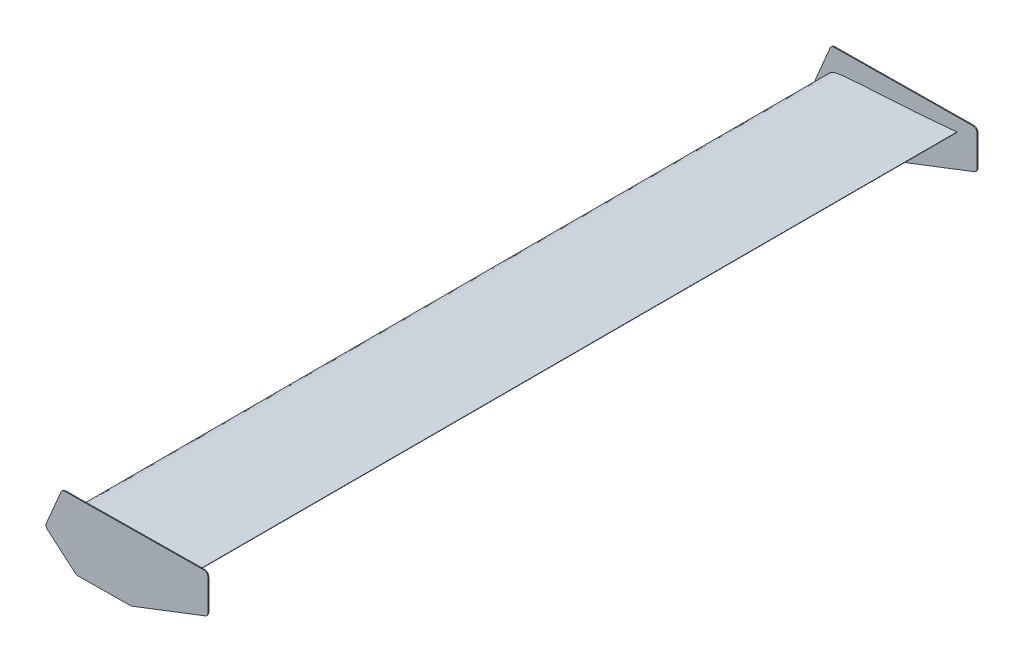
ISO-10303-21;
HEADER;
FILE_DESCRIPTION(('STEP AP214'),'2;1');
FILE_NAME('part.step','',(''),(''),'','','');
FILE_SCHEMA(('AUTOMOTIVE_DESIGN { 1 0 10303 214 1 1 1 1 }'));
ENDSEC;
DATA;
#1=APPLICATION_CONTEXT('core data for automotive mechanical design processes');
#2=APPLICATION_PROTOCOL_DEFINITION('international standard','automotive_design',2000,#1);
#3=PRODUCT_CONTEXT('',#1,'mechanical');
#4=PRODUCT('Part','Part','',(#3));
#5=PRODUCT_RELATED_PRODUCT_CATEGORY('part','',(#4));
#6=PRODUCT_DEFINITION_FORMATION('','',#4);
#7=PRODUCT_DEFINITION_CONTEXT('part definition',#1,'design');
#8=PRODUCT_DEFINITION('design','',#6,#7);
#9=PRODUCT_DEFINITION_SHAPE('','',#8);
#10=(LENGTH_UNIT() NAMED_UNIT(*) SI_UNIT(.MILLI.,.METRE.));
#11=(NAMED_UNIT(*) PLANE_ANGLE_UNIT() SI_UNIT($,.RADIAN.));
#12=(NAMED_UNIT(*) SI_UNIT($,.STERADIAN.) SOLID_ANGLE_UNIT());
#13=UNCERTAINTY_MEASURE_WITH_UNIT(LENGTH_MEASURE(1.E-05),#10,'distance_accuracy_value','');
#14=(GEOMETRIC_REPRESENTATION_CONTEXT(3) GLOBAL_UNCERTAINTY_ASSIGNED_CONTEXT((#13)) GLOBAL_UNIT_ASSIGNED_CONTEXT((#10,
#11,#12)) REPRESENTATION_CONTEXT('',''));
#15=CARTESIAN_POINT('',(0.,0.,0.));
#16=DIRECTION('',(0.,0.,1.));
#17=DIRECTION('',(1.,0.,0.));
#18=AXIS2_PLACEMENT_3D('',#15,#16,#17);
#19=CARTESIAN_POINT('',(0.,0.,899.));
#20=DIRECTION('',(0.,0.,-1.));
#21=DIRECTION('',(-1.,0.,0.));
#22=AXIS2_PLACEMENT_3D('',#19,#20,#21);
#23=PLANE('',#22);
#24=DIRECTION('',(-0.999947428083981,-0.0102538318804609,0.));
#25=VECTOR('',#24,1.);
#26=CARTESIAN_POINT('',(4.19836461655942,59.4066569608688,899.));
#27=LINE('',#26,#25);
#28=CARTESIAN_POINT('',(335.564783335885,62.8046111462092,899.));
#29=VERTEX_POINT('',#28);
#30=CARTESIAN_POINT('',(10.7496298097369,59.4738360644981,899.));
#31=VERTEX_POINT('',#30);
#32=EDGE_CURVE('E240',#29,#31,#27,.T.);
#33=ORIENTED_EDGE('',*,*,#32,.F.);
#34=CARTESIAN_POINT('',(335.667321654689,52.8051368653694,899.));
#35=DIRECTION('',(0.,0.,-1.));
#36=DIRECTION('',(-1.,0.,0.));
#37=AXIS2_PLACEMENT_3D('',#34,#35,#36);
#38=CIRCLE('',#37,10.);
#39=CARTESIAN_POINT('',(345.667321654689,52.8051368653694,899.));
#40=VERTEX_POINT('',#39);
#41=EDGE_CURVE('E277',#29,#40,#38,.T.);
#42=ORIENTED_EDGE('',*,*,#41,.T.);
#43=DIRECTION('',(0.,1.,0.));
#44=VECTOR('',#43,1.);
#45=CARTESIAN_POINT('',(345.667321654689,62.908206321893,899.));
#46=LINE('',#45,#44);
#47=CARTESIAN_POINT('',(345.667321654689,-19.4543841415105,899.));
#48=VERTEX_POINT('',#47);
#49=EDGE_CURVE('E439',#48,#40,#46,.T.);
#50=ORIENTED_EDGE('',*,*,#49,.F.);
#51=CARTESIAN_POINT('',(335.667321654689,-19.4543841415105,899.));
#52=DIRECTION('',(0.,0.,-1.));
#53=DIRECTION('',(-1.,0.,0.));
#54=AXIS2_PLACEMENT_3D('',#51,#52,#53);
#55=CIRCLE('',#54,10.);
#56=CARTESIAN_POINT('',(339.261892028957,-28.7860004979859,899.));
#57=VERTEX_POINT('',#56);
#58=EDGE_CURVE('E274',#48,#57,#55,.T.);
#59=ORIENTED_EDGE('',*,*,#58,.T.);
#60=DIRECTION('',(0.93316163564754,0.35945703742674,0.));
#61=VECTOR('',#60,1.);
#62=CARTESIAN_POINT('',(166.275090380422,-95.4211051348804,899.));
#63=LINE('',#62,#61);
#64=CARTESIAN_POINT('',(167.960784377593,-94.7717700710672,899.));
#65=VERTEX_POINT('',#64);
#66=EDGE_CURVE('E474',#65,#57,#63,.T.);
#67=ORIENTED_EDGE('',*,*,#66,.F.);
#68=CARTESIAN_POINT('',(164.366214003326,-85.4401537145918,899.));
#69=DIRECTION('',(0.,0.,-1.));
#70=DIRECTION('',(-1.,0.,0.));
#71=AXIS2_PLACEMENT_3D('',#68,#69,#70);
#72=CIRCLE('',#71,10.);
#73=CARTESIAN_POINT('',(164.46875232213,-95.4396279954316,899.));
#74=VERTEX_POINT('',#73);
#75=EDGE_CURVE('E271',#65,#74,#72,.T.);
#76=ORIENTED_EDGE('',*,*,#75,.T.);
#77=DIRECTION('',(0.99994742808398,0.010253831880461,0.));
#78=VECTOR('',#77,1.);
#79=CARTESIAN_POINT('',(38.2575012573376,-96.7338449847395,899.));
#80=LINE('',#79,#78);
#81=CARTESIAN_POINT('',(42.0078617050286,-96.6953873974287,899.));
#82=VERTEX_POINT('',#81);
#83=EDGE_CURVE('E470',#82,#74,#80,.T.);
#84=ORIENTED_EDGE('',*,*,#83,.F.);
#85=CARTESIAN_POINT('',(41.905323386224,-86.6959131165889,899.));
#86=DIRECTION('',(0.,0.,-1.));
#87=DIRECTION('',(-1.,0.,0.));
#88=AXIS2_PLACEMENT_3D('',#85,#86,#87);
#89=CIRCLE('',#88,10.);
#90=CARTESIAN_POINT('',(35.4068383285812,-94.2965507185006,899.));
#91=VERTEX_POINT('',#90);
#92=EDGE_CURVE('E262',#82,#91,#89,.T.);
#93=ORIENTED_EDGE('',*,*,#92,.T.);
#94=DIRECTION('',(0.760063760191166,-0.649848505764278,0.));
#95=VECTOR('',#94,1.);
#96=CARTESIAN_POINT('',(-35.2909208199958,-33.8505255955157,899.));
#97=LINE('',#96,#95);
#98=CARTESIAN_POINT('',(-29.7260776200808,-38.6084225348037,899.));
#99=VERTEX_POINT('',#98);
#100=EDGE_CURVE('E466',#99,#91,#97,.T.);
#101=ORIENTED_EDGE('',*,*,#100,.F.);
#102=CARTESIAN_POINT('',(-23.227592562438,-31.007784932892,899.));
#103=DIRECTION('',(0.,0.,-1.));
#104=DIRECTION('',(-1.,0.,0.));
#105=AXIS2_PLACEMENT_3D('',#102,#103,#104);
#106=CIRCLE('',#105,10.);
#107=CARTESIAN_POINT('',(-32.4360484248066,-27.1085105605493,899.));
#108=VERTEX_POINT('',#107);
#109=EDGE_CURVE('E265',#99,#108,#106,.T.);
#110=ORIENTED_EDGE('',*,*,#109,.T.);
#111=DIRECTION('',(-0.38992743723427,-0.920845586236864,0.));
#112=VECTOR('',#111,1.);
#113=CARTESIAN_POINT('',(4.19836461655942,59.4066569608688,899.));
#114=LINE('',#113,#112);
#115=CARTESIAN_POINT('',(1.64371226617284,53.373636156001,899.));
#116=VERTEX_POINT('',#115);
#117=EDGE_CURVE('E462',#116,#108,#114,.T.);
#118=ORIENTED_EDGE('',*,*,#117,.F.);
#119=CARTESIAN_POINT('',(10.8521681285415,49.4743617836583,899.));
#120=DIRECTION('',(0.,0.,-1.));
#121=DIRECTION('',(-1.,0.,0.));
#122=AXIS2_PLACEMENT_3D('',#119,#120,#121);
#123=CIRCLE('',#122,10.);
#124=EDGE_CURVE('E268',#116,#31,#123,.T.);
#125=ORIENTED_EDGE('',*,*,#124,.T.);
#126=EDGE_LOOP('',(#33,#42,#50,#59,#67,#76,#84,#93,#101,#110,#118,#125));
#127=FACE_BOUND('',#126,.T.);
#128=CARTESIAN_POINT('',(298.356820721676,31.3585654782503,899.));
#129=CARTESIAN_POINT('',(293.381111100879,30.8651510568833,899.));
#130=CARTESIAN_POINT('',(283.429423187892,29.878295571449,899.));
#131=CARTESIAN_POINT('',(263.508923944728,28.0743434441108,899.));
#132=CARTESIAN_POINT('',(238.59921585075,25.8892321159581,899.));
#133=CARTESIAN_POINT('',(208.677274934789,23.5719835240247,899.));
#134=CARTESIAN_POINT('',(178.728622319745,21.5353774354827,899.));
#135=CARTESIAN_POINT('',(148.763668449963,19.683633490526,899.));
#136=CARTESIAN_POINT('',(118.801974891729,17.7071061101312,899.));
#137=CARTESIAN_POINT('',(93.8157810071878,16.3205917388678,899.));
#138=CARTESIAN_POINT('',(73.8259988246649,15.18626481531,899.));
#139=CARTESIAN_POINT('',(58.8307850638445,14.4336174778317,899.));
#140=CARTESIAN_POINT('',(43.8642264480431,13.3023375380418,899.));
#141=CARTESIAN_POINT('',(31.4201483383805,12.0459871739729,899.));
#142=CARTESIAN_POINT('',(21.5100235212565,10.5471764194724,899.));
#143=CARTESIAN_POINT('',(14.0873822663774,9.11233853546889,899.));
#144=CARTESIAN_POINT('',(7.8787433561352,7.16108880716308,899.));
#145=CARTESIAN_POINT('',(2.75161766769261,4.69273673252576,899.));
#146=CARTESIAN_POINT('',(-1.96134946700288,-0.72896759250303,899.));
#147=CARTESIAN_POINT('',(3.53658521134143,-6.60796772053421,899.));
#148=CARTESIAN_POINT('',(9.50336317882056,-9.99885094611753,899.));
#149=CARTESIAN_POINT('',(16.2473711276859,-12.6513851799199,899.));
#150=CARTESIAN_POINT('',(24.0660968387119,-14.9398117604034,899.));
#151=CARTESIAN_POINT('',(34.3504682519946,-17.1560623737232,899.));
#152=CARTESIAN_POINT('',(47.0973249077763,-19.0843540619211,899.));
#153=CARTESIAN_POINT('',(62.3544479134201,-20.2042718792305,899.));
#154=CARTESIAN_POINT('',(77.4899059065104,-20.4665736293504,899.));
#155=CARTESIAN_POINT('',(97.5355503518148,-19.7778051948377,899.));
#156=CARTESIAN_POINT('',(122.460420541955,-17.1709318512554,899.));
#157=CARTESIAN_POINT('',(152.117488336501,-12.1232041670653,899.));
#158=CARTESIAN_POINT('',(181.655129619022,-5.89948285304463,899.));
#159=CARTESIAN_POINT('',(211.045803026573,1.5783008925517,899.));
#160=CARTESIAN_POINT('',(240.359626950343,10.0220115131504,899.));
#161=CARTESIAN_POINT('',(264.629218664053,18.0202012233495,899.));
#162=CARTESIAN_POINT('',(283.977282080235,24.9874786285377,899.));
#163=CARTESIAN_POINT('',(293.609557546321,28.7146432003694,899.));
#164=CARTESIAN_POINT('',(298.43734440978,30.5827330635794,899.));
#165=B_SPLINE_CURVE_WITH_KNOTS('',3,(#128,#129,#130,#131,#132,#133,#134,#135,#136,#137,#138,
#139,#140,#141,#142,#143,#144,#145,#146,#147,#148,#149,#150,#151,#152,#153,#154,#155,#156,#157,
#158,#159,#160,#161,#162,#163,#164),.UNSPECIFIED.,.F.,.F.,(4,1,1,1,1,1,1,1,1,1,1,1,1,1,1,1,1,1,
1,1,1,1,1,1,1,1,1,1,1,1,1,1,1,1,4),(0.,0.0244427721061945,0.0488868640389345,0.0977785916589877,
0.146679776180424,0.195594373169575,0.244518129566772,0.293441885963969,0.342378242904188,
0.366848716418896,0.391319189933605,0.415771101598765,0.440213629284816,0.45244886604217,
0.464730985941134,0.477233997408243,0.483852229950494,0.493136970824156,0.506538949171679,
0.514213997148271,0.528080018214651,0.541297784208939,0.554174880744231,0.579429854643616,
0.604273702829676,0.628897262955146,0.653399405638713,0.702284461010814,0.751259990775971,
0.800413393105454,0.849809284276661,0.899479567348494,0.949512346609459,0.974695114289043,1.),.UNSPECIFIED.);
#166=CARTESIAN_POINT('',(298.43734440978,30.5827330635794,899.));
#167=VERTEX_POINT('',#166);
#168=CARTESIAN_POINT('',(298.356820721676,31.3585654782503,899.));
#169=VERTEX_POINT('',#168);
#170=EDGE_CURVE('E252',#167,#169,#165,.F.);
#171=ORIENTED_EDGE('',*,*,#170,.F.);
#172=DIRECTION('',(0.10323549756968,-0.994656941885764,0.));
#173=VECTOR('',#172,1.);
#174=CARTESIAN_POINT('',(298.356820721676,31.3585654782503,899.));
#175=LINE('',#174,#173);
#176=EDGE_CURVE('E245',#169,#167,#175,.T.);
#177=ORIENTED_EDGE('',*,*,#176,.F.);
#178=EDGE_LOOP('',(#171,#177));
#179=FACE_BOUND('',#178,.T.);
#180=ADVANCED_FACE('F47',(#127,#179),#23,.T.);
#181=CARTESIAN_POINT('',(4.19836461655942,59.4066569608688,901.));
#182=DIRECTION('',(0.0102538318804609,-0.999947428083981,0.));
#183=DIRECTION('',(0.999947428083981,0.0102538318804609,0.));
#184=AXIS2_PLACEMENT_3D('',#181,#182,#183);
#185=PLANE('',#184);
#186=DIRECTION('',(-0.999947428083981,-0.0102538318804609,0.));
#187=VECTOR('',#186,1.);
#188=CARTESIAN_POINT('',(4.19836461655942,59.4066569608688,901.));
#189=LINE('',#188,#187);
#190=CARTESIAN_POINT('',(335.564783335885,62.8046111462092,901.));
#191=VERTEX_POINT('',#190);
#192=CARTESIAN_POINT('',(10.7496298097369,59.4738360644981,901.));
#193=VERTEX_POINT('',#192);
#194=EDGE_CURVE('E431',#191,#193,#189,.T.);
#195=ORIENTED_EDGE('',*,*,#194,.F.);
#196=DIRECTION('',(0.,0.,-1.));
#197=VECTOR('',#196,1.);
#198=CARTESIAN_POINT('',(335.564783335885,62.8046111462092,901.));
#199=LINE('',#198,#197);
#200=EDGE_CURVE('E258',#191,#29,#199,.T.);
#201=ORIENTED_EDGE('',*,*,#200,.T.);
#202=ORIENTED_EDGE('',*,*,#32,.T.);
#203=DIRECTION('',(0.,0.,-1.));
#204=VECTOR('',#203,1.);
#205=CARTESIAN_POINT('',(10.7496298097369,59.4738360644981,901.));
#206=LINE('',#205,#204);
#207=EDGE_CURVE('E250',#31,#193,#206,.F.);
#208=ORIENTED_EDGE('',*,*,#207,.T.);
#209=EDGE_LOOP('',(#195,#201,#202,#208));
#210=FACE_BOUND('',#209,.T.);
#211=ADVANCED_FACE('F546',(#210),#185,.F.);
#212=CARTESIAN_POINT('',(4.19836461655942,59.4066569608688,901.));
#213=DIRECTION('',(0.920845586236864,-0.38992743723427,0.));
#214=DIRECTION('',(0.38992743723427,0.920845586236864,0.));
#215=AXIS2_PLACEMENT_3D('',#212,#213,#214);
#216=PLANE('',#215);
#217=DIRECTION('',(-0.38992743723427,-0.920845586236864,0.));
#218=VECTOR('',#217,1.);
#219=CARTESIAN_POINT('',(4.19836461655942,59.4066569608688,901.));
#220=LINE('',#219,#218);
#221=CARTESIAN_POINT('',(1.64371226617284,53.373636156001,901.));
#222=VERTEX_POINT('',#221);
#223=CARTESIAN_POINT('',(-32.4360484248066,-27.1085105605493,901.));
#224=VERTEX_POINT('',#223);
#225=EDGE_CURVE('E438',#222,#224,#220,.T.);
#226=ORIENTED_EDGE('',*,*,#225,.F.);
#227=DIRECTION('',(0.,0.,-1.));
#228=VECTOR('',#227,1.);
#229=CARTESIAN_POINT('',(1.64371226617284,53.373636156001,901.));
#230=LINE('',#229,#228);
#231=EDGE_CURVE('E322',#222,#116,#230,.T.);
#232=ORIENTED_EDGE('',*,*,#231,.T.);
#233=ORIENTED_EDGE('',*,*,#117,.T.);
#234=DIRECTION('',(0.,0.,-1.));
#235=VECTOR('',#234,1.);
#236=CARTESIAN_POINT('',(-32.4360484248066,-27.1085105605493,901.));
#237=LINE('',#236,#235);
#238=EDGE_CURVE('E319',#108,#224,#237,.F.);
#239=ORIENTED_EDGE('',*,*,#238,.T.);
#240=EDGE_LOOP('',(#226,#232,#233,#239));
#241=FACE_BOUND('',#240,.T.);
#242=ADVANCED_FACE('F552',(#241),#216,.F.);
#243=CARTESIAN_POINT('',(-35.2909208199958,-33.8505255955157,901.));
#244=DIRECTION('',(0.649848505764278,0.760063760191167,0.));
#245=DIRECTION('',(-0.760063760191167,0.649848505764278,0.));
#246=AXIS2_PLACEMENT_3D('',#243,#244,#245);
#247=PLANE('',#246);
#248=DIRECTION('',(0.760063760191166,-0.649848505764278,0.));
#249=VECTOR('',#248,1.);
#250=CARTESIAN_POINT('',(-35.2909208199958,-33.8505255955157,901.));
#251=LINE('',#250,#249);
#252=CARTESIAN_POINT('',(-29.7260776200808,-38.6084225348037,901.));
#253=VERTEX_POINT('',#252);
#254=CARTESIAN_POINT('',(35.4068383285812,-94.2965507185006,901.));
#255=VERTEX_POINT('',#254);
#256=EDGE_CURVE('E443',#253,#255,#251,.T.);
#257=ORIENTED_EDGE('',*,*,#256,.F.);
#258=DIRECTION('',(0.,0.,-1.));
#259=VECTOR('',#258,1.);
#260=CARTESIAN_POINT('',(-29.7260776200808,-38.6084225348037,901.));
#261=LINE('',#260,#259);
#262=EDGE_CURVE('E231',#253,#99,#261,.T.);
#263=ORIENTED_EDGE('',*,*,#262,.T.);
#264=ORIENTED_EDGE('',*,*,#100,.T.);
#265=DIRECTION('',(0.,0.,-1.));
#266=VECTOR('',#265,1.);
#267=CARTESIAN_POINT('',(35.4068383285812,-94.2965507185006,901.));
#268=LINE('',#267,#266);
#269=EDGE_CURVE('E326',#91,#255,#268,.F.);
#270=ORIENTED_EDGE('',*,*,#269,.T.);
#271=EDGE_LOOP('',(#257,#263,#264,#270));
#272=FACE_BOUND('',#271,.T.);
#273=ADVANCED_FACE('F570',(#272),#247,.F.);
#274=CARTESIAN_POINT('',(38.2575012573376,-96.7338449847395,901.));
#275=DIRECTION('',(-0.010253831880461,0.999947428083981,0.));
#276=DIRECTION('',(-0.999947428083981,-0.010253831880461,0.));
#277=AXIS2_PLACEMENT_3D('',#274,#275,#276);
#278=PLANE('',#277);
#279=ORIENTED_EDGE('',*,*,#83,.T.);
#280=DIRECTION('',(0.,0.,-1.));
#281=VECTOR('',#280,1.);
#282=CARTESIAN_POINT('',(164.46875232213,-95.4396279954316,901.));
#283=LINE('',#282,#281);
#284=CARTESIAN_POINT('',(164.46875232213,-95.4396279954316,901.));
#285=VERTEX_POINT('',#284);
#286=EDGE_CURVE('E316',#74,#285,#283,.F.);
#287=ORIENTED_EDGE('',*,*,#286,.T.);
#288=DIRECTION('',(0.99994742808398,0.010253831880461,0.));
#289=VECTOR('',#288,1.);
#290=CARTESIAN_POINT('',(38.2575012573376,-96.7338449847395,901.));
#291=LINE('',#290,#289);
#292=CARTESIAN_POINT('',(42.0078617050286,-96.6953873974287,901.));
#293=VERTEX_POINT('',#292);
#294=EDGE_CURVE('E447',#293,#285,#291,.T.);
#295=ORIENTED_EDGE('',*,*,#294,.F.);
#296=DIRECTION('',(0.,0.,-1.));
#297=VECTOR('',#296,1.);
#298=CARTESIAN_POINT('',(42.0078617050286,-96.6953873974287,901.));
#299=LINE('',#298,#297);
#300=EDGE_CURVE('E312',#293,#82,#299,.T.);
#301=ORIENTED_EDGE('',*,*,#300,.T.);
#302=EDGE_LOOP('',(#279,#287,#295,#301));
#303=FACE_BOUND('',#302,.T.);
#304=ADVANCED_FACE('F566',(#303),#278,.F.);
#305=CARTESIAN_POINT('',(166.275090380422,-95.4211051348804,901.));
#306=DIRECTION('',(-0.359457037426739,0.93316163564754,0.));
#307=DIRECTION('',(-0.93316163564754,-0.35945703742674,0.));
#308=AXIS2_PLACEMENT_3D('',#305,#306,#307);
#309=PLANE('',#308);
#310=ORIENTED_EDGE('',*,*,#66,.T.);
#311=DIRECTION('',(0.,0.,-1.));
#312=VECTOR('',#311,1.);
#313=CARTESIAN_POINT('',(339.261892028957,-28.7860004979859,901.));
#314=LINE('',#313,#312);
#315=CARTESIAN_POINT('',(339.261892028957,-28.7860004979859,901.));
#316=VERTEX_POINT('',#315);
#317=EDGE_CURVE('E309',#57,#316,#314,.F.);
#318=ORIENTED_EDGE('',*,*,#317,.T.);
#319=DIRECTION('',(0.93316163564754,0.35945703742674,0.));
#320=VECTOR('',#319,1.);
#321=CARTESIAN_POINT('',(166.275090380422,-95.4211051348804,901.));
#322=LINE('',#321,#320);
#323=CARTESIAN_POINT('',(167.960784377593,-94.7717700710672,901.));
#324=VERTEX_POINT('',#323);
#325=EDGE_CURVE('E451',#324,#316,#322,.T.);
#326=ORIENTED_EDGE('',*,*,#325,.F.);
#327=DIRECTION('',(0.,0.,-1.));
#328=VECTOR('',#327,1.);
#329=CARTESIAN_POINT('',(167.960784377593,-94.7717700710672,901.));
#330=LINE('',#329,#328);
#331=EDGE_CURVE('E305',#324,#65,#330,.T.);
#332=ORIENTED_EDGE('',*,*,#331,.T.);
#333=EDGE_LOOP('',(#310,#318,#326,#332));
#334=FACE_BOUND('',#333,.T.);
#335=ADVANCED_FACE('F562',(#334),#309,.F.);
#336=CARTESIAN_POINT('',(345.667321654689,62.908206321893,901.));
#337=DIRECTION('',(-1.,0.,0.));
#338=DIRECTION('',(0.,0.,1.));
#339=AXIS2_PLACEMENT_3D('',#336,#337,#338);
#340=PLANE('',#339);
#341=ORIENTED_EDGE('',*,*,#49,.T.);
#342=DIRECTION('',(0.,0.,-1.));
#343=VECTOR('',#342,1.);
#344=CARTESIAN_POINT('',(345.667321654689,52.8051368653694,901.));
#345=LINE('',#344,#343);
#346=CARTESIAN_POINT('',(345.667321654689,52.8051368653694,901.));
#347=VERTEX_POINT('',#346);
#348=EDGE_CURVE('E284',#40,#347,#345,.F.);
#349=ORIENTED_EDGE('',*,*,#348,.T.);
#350=DIRECTION('',(0.,1.,0.));
#351=VECTOR('',#350,1.);
#352=CARTESIAN_POINT('',(345.667321654689,62.908206321893,901.));
#353=LINE('',#352,#351);
#354=CARTESIAN_POINT('',(345.667321654689,-19.4543841415105,901.));
#355=VERTEX_POINT('',#354);
#356=EDGE_CURVE('E455',#355,#347,#353,.T.);
#357=ORIENTED_EDGE('',*,*,#356,.F.);
#358=DIRECTION('',(0.,0.,-1.));
#359=VECTOR('',#358,1.);
#360=CARTESIAN_POINT('',(345.667321654689,-19.4543841415105,901.));
#361=LINE('',#360,#359);
#362=EDGE_CURVE('E280',#355,#48,#361,.T.);
#363=ORIENTED_EDGE('',*,*,#362,.T.);
#364=EDGE_LOOP('',(#341,#349,#357,#363));
#365=FACE_BOUND('',#364,.T.);
#366=ADVANCED_FACE('F559',(#365),#340,.F.);
#367=CARTESIAN_POINT('',(0.,0.,901.));
#368=DIRECTION('',(0.,0.,-1.));
#369=DIRECTION('',(-1.,0.,0.));
#370=AXIS2_PLACEMENT_3D('',#367,#368,#369);
#371=PLANE('',#370);
#372=ORIENTED_EDGE('',*,*,#356,.T.);
#373=CARTESIAN_POINT('',(335.667321654689,52.8051368653694,901.));
#374=DIRECTION('',(0.,0.,-1.));
#375=DIRECTION('',(-1.,0.,0.));
#376=AXIS2_PLACEMENT_3D('',#373,#374,#375);
#377=CIRCLE('',#376,10.);
#378=EDGE_CURVE('E302',#347,#191,#377,.F.);
#379=ORIENTED_EDGE('',*,*,#378,.T.);
#380=ORIENTED_EDGE('',*,*,#194,.T.);
#381=CARTESIAN_POINT('',(10.8521681285415,49.4743617836583,901.));
#382=DIRECTION('',(0.,0.,-1.));
#383=DIRECTION('',(-1.,0.,0.));
#384=AXIS2_PLACEMENT_3D('',#381,#382,#383);
#385=CIRCLE('',#384,10.);
#386=EDGE_CURVE('E293',#193,#222,#385,.F.);
#387=ORIENTED_EDGE('',*,*,#386,.T.);
#388=ORIENTED_EDGE('',*,*,#225,.T.);
#389=CARTESIAN_POINT('',(-23.227592562438,-31.007784932892,901.));
#390=DIRECTION('',(0.,0.,-1.));
#391=DIRECTION('',(-1.,0.,0.));
#392=AXIS2_PLACEMENT_3D('',#389,#390,#391);
#393=CIRCLE('',#392,10.);
#394=EDGE_CURVE('E290',#224,#253,#393,.F.);
#395=ORIENTED_EDGE('',*,*,#394,.T.);
#396=ORIENTED_EDGE('',*,*,#256,.T.);
#397=CARTESIAN_POINT('',(41.905323386224,-86.6959131165889,901.));
#398=DIRECTION('',(0.,0.,-1.));
#399=DIRECTION('',(-1.,0.,0.));
#400=AXIS2_PLACEMENT_3D('',#397,#398,#399);
#401=CIRCLE('',#400,10.);
#402=EDGE_CURVE('E287',#255,#293,#401,.F.);
#403=ORIENTED_EDGE('',*,*,#402,.T.);
#404=ORIENTED_EDGE('',*,*,#294,.T.);
#405=CARTESIAN_POINT('',(164.366214003326,-85.4401537145918,901.));
#406=DIRECTION('',(0.,0.,-1.));
#407=DIRECTION('',(-1.,0.,0.));
#408=AXIS2_PLACEMENT_3D('',#405,#406,#407);
#409=CIRCLE('',#408,10.);
#410=EDGE_CURVE('E296',#285,#324,#409,.F.);
#411=ORIENTED_EDGE('',*,*,#410,.T.);
#412=ORIENTED_EDGE('',*,*,#325,.T.);
#413=CARTESIAN_POINT('',(335.667321654689,-19.4543841415105,901.));
#414=DIRECTION('',(0.,0.,-1.));
#415=DIRECTION('',(-1.,0.,0.));
#416=AXIS2_PLACEMENT_3D('',#413,#414,#415);
#417=CIRCLE('',#416,10.);
#418=EDGE_CURVE('E299',#316,#355,#417,.F.);
#419=ORIENTED_EDGE('',*,*,#418,.T.);
#420=EDGE_LOOP('',(#372,#379,#380,#387,#388,#395,#396,#403,#404,#411,#412,#419));
#421=FACE_BOUND('',#420,.T.);
#422=ADVANCED_FACE('F497',(#421),#371,.F.);
#423=CARTESIAN_POINT('',(298.356820721676,31.3585654782503,900.));
#424=CARTESIAN_POINT('',(293.381111100879,30.8651510568833,900.));
#425=CARTESIAN_POINT('',(283.429423187892,29.878295571449,900.));
#426=CARTESIAN_POINT('',(263.508923944728,28.0743434441108,900.));
#427=CARTESIAN_POINT('',(238.59921585075,25.8892321159581,900.));
#428=CARTESIAN_POINT('',(208.677274934789,23.5719835240247,900.));
#429=CARTESIAN_POINT('',(178.728622319745,21.5353774354827,900.));
#430=CARTESIAN_POINT('',(148.763668449963,19.683633490526,900.));
#431=CARTESIAN_POINT('',(118.801974891729,17.7071061101312,900.));
#432=CARTESIAN_POINT('',(93.8157810071878,16.3205917388678,900.));
#433=CARTESIAN_POINT('',(73.8259988246649,15.18626481531,900.));
#434=CARTESIAN_POINT('',(58.8307850638445,14.4336174778317,900.));
#435=CARTESIAN_POINT('',(43.8642264480431,13.3023375380418,900.));
#436=CARTESIAN_POINT('',(31.4201483383805,12.0459871739729,900.));
#437=CARTESIAN_POINT('',(21.5100235212565,10.5471764194724,900.));
#438=CARTESIAN_POINT('',(14.0873822663774,9.11233853546889,900.));
#439=CARTESIAN_POINT('',(7.8787433561352,7.16108880716308,900.));
#440=CARTESIAN_POINT('',(2.75161766769261,4.69273673252576,900.));
#441=CARTESIAN_POINT('',(-1.96134946700288,-0.72896759250303,900.));
#442=CARTESIAN_POINT('',(3.53658521134143,-6.60796772053421,900.));
#443=CARTESIAN_POINT('',(9.50336317882056,-9.99885094611753,900.));
#444=CARTESIAN_POINT('',(16.2473711276859,-12.6513851799199,900.));
#445=CARTESIAN_POINT('',(24.0660968387119,-14.9398117604034,900.));
#446=CARTESIAN_POINT('',(34.3504682519946,-17.1560623737232,900.));
#447=CARTESIAN_POINT('',(47.0973249077763,-19.0843540619211,900.));
#448=CARTESIAN_POINT('',(62.3544479134201,-20.2042718792305,900.));
#449=CARTESIAN_POINT('',(77.4899059065104,-20.4665736293504,900.));
#450=CARTESIAN_POINT('',(97.5355503518148,-19.7778051948377,900.));
#451=CARTESIAN_POINT('',(122.460420541955,-17.1709318512554,900.));
#452=CARTESIAN_POINT('',(152.117488336501,-12.1232041670653,900.));
#453=CARTESIAN_POINT('',(181.655129619022,-5.89948285304463,900.));
#454=CARTESIAN_POINT('',(211.045803026573,1.5783008925517,900.));
#455=CARTESIAN_POINT('',(240.359626950343,10.0220115131504,900.));
#456=CARTESIAN_POINT('',(264.629218664053,18.0202012233495,900.));
#457=CARTESIAN_POINT('',(283.977282080235,24.9874786285377,900.));
#458=CARTESIAN_POINT('',(293.609557546321,28.7146432003694,900.));
#459=CARTESIAN_POINT('',(298.43734440978,30.5827330635794,900.));
#460=B_SPLINE_CURVE_WITH_KNOTS('',3,(#423,#424,#425,#426,#427,#428,#429,#430,#431,#432,#433,
#434,#435,#436,#437,#438,#439,#440,#441,#442,#443,#444,#445,#446,#447,#448,#449,#450,#451,#452,
#453,#454,#455,#456,#457,#458,#459),.UNSPECIFIED.,.F.,.F.,(4,1,1,1,1,1,1,1,1,1,1,1,1,1,1,1,1,1,
1,1,1,1,1,1,1,1,1,1,1,1,1,1,1,1,4),(0.,0.0244427721061945,0.0488868640389345,0.0977785916589877,
0.146679776180424,0.195594373169575,0.244518129566772,0.293441885963969,0.342378242904188,
0.366848716418896,0.391319189933605,0.415771101598765,0.440213629284816,0.45244886604217,
0.464730985941134,0.477233997408243,0.483852229950494,0.493136970824156,0.506538949171679,
0.514213997148271,0.528080018214651,0.541297784208939,0.554174880744231,0.579429854643616,
0.604273702829676,0.628897262955146,0.653399405638713,0.702284461010814,0.751259990775971,
0.800413393105454,0.849809284276661,0.899479567348494,0.949512346609459,0.974695114289043,1.),.UNSPECIFIED.);
#461=DIRECTION('',(0.,0.,-1.));
#462=VECTOR('',#461,1.);
#463=SURFACE_OF_LINEAR_EXTRUSION('',#460,#462);
#464=DIRECTION('',(0.,0.,-1.));
#465=VECTOR('',#464,1.);
#466=CARTESIAN_POINT('',(298.356820721676,31.3585654782503,900.));
#467=LINE('',#466,#465);
#468=CARTESIAN_POINT('',(298.356820721676,31.3585654782503,-899.));
#469=VERTEX_POINT('',#468);
#470=EDGE_CURVE('E238',#169,#469,#467,.T.);
#471=ORIENTED_EDGE('',*,*,#470,.T.);
#472=CARTESIAN_POINT('',(298.356820721676,31.3585654782503,-899.));
#473=CARTESIAN_POINT('',(293.381111100879,30.8651510568833,-899.));
#474=CARTESIAN_POINT('',(283.429423187892,29.878295571449,-899.));
#475=CARTESIAN_POINT('',(263.508923944728,28.0743434441108,-899.));
#476=CARTESIAN_POINT('',(238.59921585075,25.8892321159581,-899.));
#477=CARTESIAN_POINT('',(208.677274934789,23.5719835240247,-899.));
#478=CARTESIAN_POINT('',(178.728622319745,21.5353774354827,-899.));
#479=CARTESIAN_POINT('',(148.763668449963,19.683633490526,-899.));
#480=CARTESIAN_POINT('',(118.801974891729,17.7071061101312,-899.));
#481=CARTESIAN_POINT('',(93.8157810071878,16.3205917388678,-899.));
#482=CARTESIAN_POINT('',(73.8259988246649,15.18626481531,-899.));
#483=CARTESIAN_POINT('',(58.8307850638445,14.4336174778317,-899.));
#484=CARTESIAN_POINT('',(43.8642264480431,13.3023375380418,-899.));
#485=CARTESIAN_POINT('',(31.4201483383805,12.0459871739729,-899.));
#486=CARTESIAN_POINT('',(21.5100235212565,10.5471764194724,-899.));
#487=CARTESIAN_POINT('',(14.0873822663774,9.11233853546889,-899.));
#488=CARTESIAN_POINT('',(7.8787433561352,7.16108880716308,-899.));
#489=CARTESIAN_POINT('',(2.75161766769261,4.69273673252576,-899.));
#490=CARTESIAN_POINT('',(-1.96134946700288,-0.72896759250303,-899.));
#491=CARTESIAN_POINT('',(3.53658521134143,-6.60796772053421,-899.));
#492=CARTESIAN_POINT('',(9.50336317882056,-9.99885094611753,-899.));
#493=CARTESIAN_POINT('',(16.2473711276859,-12.6513851799199,-899.));
#494=CARTESIAN_POINT('',(24.0660968387119,-14.9398117604034,-899.));
#495=CARTESIAN_POINT('',(34.3504682519946,-17.1560623737232,-899.));
#496=CARTESIAN_POINT('',(47.0973249077763,-19.0843540619211,-899.));
#497=CARTESIAN_POINT('',(62.3544479134201,-20.2042718792305,-899.));
#498=CARTESIAN_POINT('',(77.4899059065104,-20.4665736293504,-899.));
#499=CARTESIAN_POINT('',(97.5355503518148,-19.7778051948377,-899.));
#500=CARTESIAN_POINT('',(122.460420541955,-17.1709318512554,-899.));
#501=CARTESIAN_POINT('',(152.117488336501,-12.1232041670653,-899.));
#502=CARTESIAN_POINT('',(181.655129619022,-5.89948285304463,-899.));
#503=CARTESIAN_POINT('',(211.045803026573,1.5783008925517,-899.));
#504=CARTESIAN_POINT('',(240.359626950343,10.0220115131504,-899.));
#505=CARTESIAN_POINT('',(264.629218664053,18.0202012233495,-899.));
#506=CARTESIAN_POINT('',(283.977282080235,24.9874786285377,-899.));
#507=CARTESIAN_POINT('',(293.609557546321,28.7146432003694,-899.));
#508=CARTESIAN_POINT('',(298.43734440978,30.5827330635794,-899.));
#509=B_SPLINE_CURVE_WITH_KNOTS('',3,(#472,#473,#474,#475,#476,#477,#478,#479,#480,#481,#482,
#483,#484,#485,#486,#487,#488,#489,#490,#491,#492,#493,#494,#495,#496,#497,#498,#499,#500,#501,
#502,#503,#504,#505,#506,#507,#508),.UNSPECIFIED.,.F.,.F.,(4,1,1,1,1,1,1,1,1,1,1,1,1,1,1,1,1,1,
1,1,1,1,1,1,1,1,1,1,1,1,1,1,1,1,4),(0.,0.0244427721061945,0.0488868640389345,0.0977785916589877,
0.146679776180424,0.195594373169575,0.244518129566772,0.293441885963969,0.342378242904188,
0.366848716418896,0.391319189933605,0.415771101598765,0.440213629284816,0.45244886604217,
0.464730985941134,0.477233997408243,0.483852229950494,0.493136970824156,0.506538949171679,
0.514213997148271,0.528080018214651,0.541297784208939,0.554174880744231,0.579429854643616,
0.604273702829676,0.628897262955146,0.653399405638713,0.702284461010814,0.751259990775971,
0.800413393105454,0.849809284276661,0.899479567348494,0.949512346609459,0.974695114289043,1.),.UNSPECIFIED.);
#510=CARTESIAN_POINT('',(298.43734440978,30.5827330635794,-899.));
#511=VERTEX_POINT('',#510);
#512=EDGE_CURVE('E224',#469,#511,#509,.T.);
#513=ORIENTED_EDGE('',*,*,#512,.T.);
#514=DIRECTION('',(0.,0.,-1.));
#515=VECTOR('',#514,1.);
#516=CARTESIAN_POINT('',(298.43734440978,30.5827330635794,900.));
#517=LINE('',#516,#515);
#518=EDGE_CURVE('E237',#167,#511,#517,.T.);
#519=ORIENTED_EDGE('',*,*,#518,.F.);
#520=ORIENTED_EDGE('',*,*,#170,.T.);
#521=EDGE_LOOP('',(#471,#513,#519,#520));
#522=FACE_BOUND('',#521,.T.);
#523=ADVANCED_FACE('F235',(#522),#463,.F.);
#524=CARTESIAN_POINT('',(298.356820721676,31.3585654782503,900.));
#525=DIRECTION('',(-0.994656941885764,-0.103235497569679,0.));
#526=DIRECTION('',(0.10323549756968,-0.994656941885764,0.));
#527=AXIS2_PLACEMENT_3D('',#524,#525,#526);
#528=PLANE('',#527);
#529=ORIENTED_EDGE('',*,*,#518,.T.);
#530=DIRECTION('',(-0.10323549756968,0.994656941885764,0.));
#531=VECTOR('',#530,1.);
#532=CARTESIAN_POINT('',(298.356820721676,31.3585654782503,-899.));
#533=LINE('',#532,#531);
#534=EDGE_CURVE('E221',#511,#469,#533,.T.);
#535=ORIENTED_EDGE('',*,*,#534,.T.);
#536=ORIENTED_EDGE('',*,*,#470,.F.);
#537=ORIENTED_EDGE('',*,*,#176,.T.);
#538=EDGE_LOOP('',(#529,#535,#536,#537));
#539=FACE_BOUND('',#538,.T.);
#540=ADVANCED_FACE('F244',(#539),#528,.F.);
#541=CARTESIAN_POINT('',(335.667321654689,52.8051368653694,901.));
#542=DIRECTION('',(0.,0.,-1.));
#543=DIRECTION('',(-1.,0.,0.));
#544=AXIS2_PLACEMENT_3D('',#541,#542,#543);
#545=CYLINDRICAL_SURFACE('',#544,10.);
#546=ORIENTED_EDGE('',*,*,#378,.F.);
#547=ORIENTED_EDGE('',*,*,#348,.F.);
#548=ORIENTED_EDGE('',*,*,#41,.F.);
#549=ORIENTED_EDGE('',*,*,#200,.F.);
#550=EDGE_LOOP('',(#546,#547,#548,#549));
#551=FACE_BOUND('',#550,.T.);
#552=ADVANCED_FACE('F499',(#551),#545,.T.);
#553=CARTESIAN_POINT('',(335.667321654689,-19.4543841415105,901.));
#554=DIRECTION('',(0.,0.,-1.));
#555=DIRECTION('',(-1.,0.,0.));
#556=AXIS2_PLACEMENT_3D('',#553,#554,#555);
#557=CYLINDRICAL_SURFACE('',#556,10.);
#558=ORIENTED_EDGE('',*,*,#418,.F.);
#559=ORIENTED_EDGE('',*,*,#317,.F.);
#560=ORIENTED_EDGE('',*,*,#58,.F.);
#561=ORIENTED_EDGE('',*,*,#362,.F.);
#562=EDGE_LOOP('',(#558,#559,#560,#561));
#563=FACE_BOUND('',#562,.T.);
#564=ADVANCED_FACE('F502',(#563),#557,.T.);
#565=CARTESIAN_POINT('',(164.366214003326,-85.4401537145918,901.));
#566=DIRECTION('',(0.,0.,-1.));
#567=DIRECTION('',(-1.,0.,0.));
#568=AXIS2_PLACEMENT_3D('',#565,#566,#567);
#569=CYLINDRICAL_SURFACE('',#568,10.);
#570=ORIENTED_EDGE('',*,*,#410,.F.);
#571=ORIENTED_EDGE('',*,*,#286,.F.);
#572=ORIENTED_EDGE('',*,*,#75,.F.);
#573=ORIENTED_EDGE('',*,*,#331,.F.);
#574=EDGE_LOOP('',(#570,#571,#572,#573));
#575=FACE_BOUND('',#574,.T.);
#576=ADVANCED_FACE('F506',(#575),#569,.T.);
#577=CARTESIAN_POINT('',(10.8521681285415,49.4743617836583,901.));
#578=DIRECTION('',(0.,0.,-1.));
#579=DIRECTION('',(-1.,0.,0.));
#580=AXIS2_PLACEMENT_3D('',#577,#578,#579);
#581=CYLINDRICAL_SURFACE('',#580,10.);
#582=ORIENTED_EDGE('',*,*,#386,.F.);
#583=ORIENTED_EDGE('',*,*,#207,.F.);
#584=ORIENTED_EDGE('',*,*,#124,.F.);
#585=ORIENTED_EDGE('',*,*,#231,.F.);
#586=EDGE_LOOP('',(#582,#583,#584,#585));
#587=FACE_BOUND('',#586,.T.);
#588=ADVANCED_FACE('F510',(#587),#581,.T.);
#589=CARTESIAN_POINT('',(-23.227592562438,-31.007784932892,901.));
#590=DIRECTION('',(0.,0.,-1.));
#591=DIRECTION('',(-1.,0.,0.));
#592=AXIS2_PLACEMENT_3D('',#589,#590,#591);
#593=CYLINDRICAL_SURFACE('',#592,10.);
#594=ORIENTED_EDGE('',*,*,#394,.F.);
#595=ORIENTED_EDGE('',*,*,#238,.F.);
#596=ORIENTED_EDGE('',*,*,#109,.F.);
#597=ORIENTED_EDGE('',*,*,#262,.F.);
#598=EDGE_LOOP('',(#594,#595,#596,#597));
#599=FACE_BOUND('',#598,.T.);
#600=ADVANCED_FACE('F514',(#599),#593,.T.);
#601=CARTESIAN_POINT('',(41.905323386224,-86.6959131165889,901.));
#602=DIRECTION('',(0.,0.,-1.));
#603=DIRECTION('',(-1.,0.,0.));
#604=AXIS2_PLACEMENT_3D('',#601,#602,#603);
#605=CYLINDRICAL_SURFACE('',#604,10.);
#606=ORIENTED_EDGE('',*,*,#402,.F.);
#607=ORIENTED_EDGE('',*,*,#269,.F.);
#608=ORIENTED_EDGE('',*,*,#92,.F.);
#609=ORIENTED_EDGE('',*,*,#300,.F.);
#610=EDGE_LOOP('',(#606,#607,#608,#609));
#611=FACE_BOUND('',#610,.T.);
#612=ADVANCED_FACE('F518',(#611),#605,.T.);
#613=CARTESIAN_POINT('',(0.,0.,-899.));
#614=DIRECTION('',(0.,0.,1.));
#615=DIRECTION('',(-1.,0.,0.));
#616=AXIS2_PLACEMENT_3D('',#613,#614,#615);
#617=PLANE('',#616);
#618=DIRECTION('',(0.,1.,0.));
#619=VECTOR('',#618,1.);
#620=CARTESIAN_POINT('',(345.667321654689,62.908206321893,-899.));
#621=LINE('',#620,#619);
#622=CARTESIAN_POINT('',(345.667321654689,-19.4543841415105,-899.));
#623=VERTEX_POINT('',#622);
#624=CARTESIAN_POINT('',(345.667321654689,52.8051368653694,-899.));
#625=VERTEX_POINT('',#624);
#626=EDGE_CURVE('E822',#623,#625,#621,.T.);
#627=ORIENTED_EDGE('',*,*,#626,.T.);
#628=CARTESIAN_POINT('',(335.667321654689,52.8051368653694,-899.));
#629=DIRECTION('',(0.,0.,1.));
#630=DIRECTION('',(1.,0.,0.));
#631=AXIS2_PLACEMENT_3D('',#628,#629,#630);
#632=CIRCLE('',#631,10.);
#633=CARTESIAN_POINT('',(335.564783335885,62.8046111462092,-899.));
#634=VERTEX_POINT('',#633);
#635=EDGE_CURVE('E353',#625,#634,#632,.T.);
#636=ORIENTED_EDGE('',*,*,#635,.T.);
#637=DIRECTION('',(-0.999947428083981,-0.0102538318804609,0.));
#638=VECTOR('',#637,1.);
#639=CARTESIAN_POINT('',(4.19836461655942,59.4066569608688,-899.));
#640=LINE('',#639,#638);
#641=CARTESIAN_POINT('',(10.7496298097369,59.4738360644981,-899.));
#642=VERTEX_POINT('',#641);
#643=EDGE_CURVE('E828',#634,#642,#640,.T.);
#644=ORIENTED_EDGE('',*,*,#643,.T.);
#645=CARTESIAN_POINT('',(10.8521681285415,49.4743617836583,-899.));
#646=DIRECTION('',(0.,0.,1.));
#647=DIRECTION('',(1.,0.,0.));
#648=AXIS2_PLACEMENT_3D('',#645,#646,#647);
#649=CIRCLE('',#648,10.);
#650=CARTESIAN_POINT('',(1.64371226617284,53.373636156001,-899.));
#651=VERTEX_POINT('',#650);
#652=EDGE_CURVE('E344',#642,#651,#649,.T.);
#653=ORIENTED_EDGE('',*,*,#652,.T.);
#654=DIRECTION('',(-0.38992743723427,-0.920845586236864,0.));
#655=VECTOR('',#654,1.);
#656=CARTESIAN_POINT('',(4.19836461655942,59.4066569608688,-899.));
#657=LINE('',#656,#655);
#658=CARTESIAN_POINT('',(-32.4360484248066,-27.1085105605493,-899.));
#659=VERTEX_POINT('',#658);
#660=EDGE_CURVE('E418',#651,#659,#657,.T.);
#661=ORIENTED_EDGE('',*,*,#660,.T.);
#662=CARTESIAN_POINT('',(-23.227592562438,-31.0077849328921,-899.));
#663=DIRECTION('',(0.,0.,1.));
#664=DIRECTION('',(1.,0.,0.));
#665=AXIS2_PLACEMENT_3D('',#662,#663,#664);
#666=CIRCLE('',#665,10.);
#667=CARTESIAN_POINT('',(-29.7260776200808,-38.6084225348037,-899.));
#668=VERTEX_POINT('',#667);
#669=EDGE_CURVE('E341',#659,#668,#666,.T.);
#670=ORIENTED_EDGE('',*,*,#669,.T.);
#671=DIRECTION('',(0.760063760191166,-0.649848505764278,0.));
#672=VECTOR('',#671,1.);
#673=CARTESIAN_POINT('',(-35.2909208199958,-33.8505255955157,-899.));
#674=LINE('',#673,#672);
#675=CARTESIAN_POINT('',(35.4068383285812,-94.2965507185006,-899.));
#676=VERTEX_POINT('',#675);
#677=EDGE_CURVE('E407',#668,#676,#674,.T.);
#678=ORIENTED_EDGE('',*,*,#677,.T.);
#679=CARTESIAN_POINT('',(41.905323386224,-86.6959131165889,-899.));
#680=DIRECTION('',(0.,0.,1.));
#681=DIRECTION('',(1.,0.,0.));
#682=AXIS2_PLACEMENT_3D('',#679,#680,#681);
#683=CIRCLE('',#682,10.);
#684=CARTESIAN_POINT('',(42.0078617050286,-96.6953873974287,-899.));
#685=VERTEX_POINT('',#684);
#686=EDGE_CURVE('E338',#676,#685,#683,.T.);
#687=ORIENTED_EDGE('',*,*,#686,.T.);
#688=DIRECTION('',(0.99994742808398,0.010253831880461,0.));
#689=VECTOR('',#688,1.);
#690=CARTESIAN_POINT('',(38.2575012573376,-96.7338449847395,-899.));
#691=LINE('',#690,#689);
#692=CARTESIAN_POINT('',(164.46875232213,-95.4396279954316,-899.));
#693=VERTEX_POINT('',#692);
#694=EDGE_CURVE('E419',#685,#693,#691,.T.);
#695=ORIENTED_EDGE('',*,*,#694,.T.);
#696=CARTESIAN_POINT('',(164.366214003326,-85.4401537145918,-899.));
#697=DIRECTION('',(0.,0.,1.));
#698=DIRECTION('',(1.,0.,0.));
#699=AXIS2_PLACEMENT_3D('',#696,#697,#698);
#700=CIRCLE('',#699,10.);
#701=CARTESIAN_POINT('',(167.960784377593,-94.7717700710672,-899.));
#702=VERTEX_POINT('',#701);
#703=EDGE_CURVE('E347',#693,#702,#700,.T.);
#704=ORIENTED_EDGE('',*,*,#703,.T.);
#705=DIRECTION('',(0.93316163564754,0.35945703742674,0.));
#706=VECTOR('',#705,1.);
#707=CARTESIAN_POINT('',(166.275090380422,-95.4211051348804,-899.));
#708=LINE('',#707,#706);
#709=CARTESIAN_POINT('',(339.261892028957,-28.7860004979859,-899.));
#710=VERTEX_POINT('',#709);
#711=EDGE_CURVE('E425',#702,#710,#708,.T.);
#712=ORIENTED_EDGE('',*,*,#711,.T.);
#713=CARTESIAN_POINT('',(335.667321654689,-19.4543841415105,-899.));
#714=DIRECTION('',(0.,0.,1.));
#715=DIRECTION('',(1.,0.,0.));
#716=AXIS2_PLACEMENT_3D('',#713,#714,#715);
#717=CIRCLE('',#716,10.);
#718=EDGE_CURVE('E350',#710,#623,#717,.T.);
#719=ORIENTED_EDGE('',*,*,#718,.T.);
#720=EDGE_LOOP('',(#627,#636,#644,#653,#661,#670,#678,#687,#695,#704,#712,#719));
#721=FACE_BOUND('',#720,.T.);
#722=ORIENTED_EDGE('',*,*,#512,.F.);
#723=ORIENTED_EDGE('',*,*,#534,.F.);
#724=EDGE_LOOP('',(#722,#723));
#725=FACE_BOUND('',#724,.T.);
#726=ADVANCED_FACE('F223',(#721,#725),#617,.T.);
#727=CARTESIAN_POINT('',(4.19836461655942,59.4066569608688,-901.));
#728=DIRECTION('',(-0.0102538318804609,0.999947428083981,0.));
#729=DIRECTION('',(-0.999947428083981,-0.0102538318804609,0.));
#730=AXIS2_PLACEMENT_3D('',#727,#728,#729);
#731=PLANE('',#730);
#732=ORIENTED_EDGE('',*,*,#643,.F.);
#733=DIRECTION('',(0.,0.,1.));
#734=VECTOR('',#733,1.);
#735=CARTESIAN_POINT('',(335.564783335885,62.8046111462092,-901.));
#736=LINE('',#735,#734);
#737=CARTESIAN_POINT('',(335.564783335885,62.8046111462092,-901.));
#738=VERTEX_POINT('',#737);
#739=EDGE_CURVE('E360',#634,#738,#736,.F.);
#740=ORIENTED_EDGE('',*,*,#739,.T.);
#741=DIRECTION('',(-0.999947428083981,-0.0102538318804609,0.));
#742=VECTOR('',#741,1.);
#743=CARTESIAN_POINT('',(4.19836461655942,59.4066569608688,-901.));
#744=LINE('',#743,#742);
#745=CARTESIAN_POINT('',(10.7496298097369,59.4738360644981,-901.));
#746=VERTEX_POINT('',#745);
#747=EDGE_CURVE('E423',#738,#746,#744,.T.);
#748=ORIENTED_EDGE('',*,*,#747,.T.);
#749=DIRECTION('',(0.,0.,1.));
#750=VECTOR('',#749,1.);
#751=CARTESIAN_POINT('',(10.7496298097369,59.4738360644981,-901.));
#752=LINE('',#751,#750);
#753=EDGE_CURVE('E356',#746,#642,#752,.T.);
#754=ORIENTED_EDGE('',*,*,#753,.T.);
#755=EDGE_LOOP('',(#732,#740,#748,#754));
#756=FACE_BOUND('',#755,.T.);
#757=ADVANCED_FACE('F662',(#756),#731,.T.);
#758=CARTESIAN_POINT('',(345.667321654689,62.908206321893,-901.));
#759=DIRECTION('',(1.,0.,0.));
#760=DIRECTION('',(0.,0.,-1.));
#761=AXIS2_PLACEMENT_3D('',#758,#759,#760);
#762=PLANE('',#761);
#763=DIRECTION('',(0.,1.,0.));
#764=VECTOR('',#763,1.);
#765=CARTESIAN_POINT('',(345.667321654689,62.908206321893,-901.));
#766=LINE('',#765,#764);
#767=CARTESIAN_POINT('',(345.667321654689,-19.4543841415105,-901.));
#768=VERTEX_POINT('',#767);
#769=CARTESIAN_POINT('',(345.667321654689,52.8051368653694,-901.));
#770=VERTEX_POINT('',#769);
#771=EDGE_CURVE('E817',#768,#770,#766,.T.);
#772=ORIENTED_EDGE('',*,*,#771,.T.);
#773=DIRECTION('',(0.,0.,1.));
#774=VECTOR('',#773,1.);
#775=CARTESIAN_POINT('',(345.667321654689,52.8051368653694,-901.));
#776=LINE('',#775,#774);
#777=EDGE_CURVE('E334',#770,#625,#776,.T.);
#778=ORIENTED_EDGE('',*,*,#777,.T.);
#779=ORIENTED_EDGE('',*,*,#626,.F.);
#780=DIRECTION('',(0.,0.,1.));
#781=VECTOR('',#780,1.);
#782=CARTESIAN_POINT('',(345.667321654689,-19.4543841415105,-901.));
#783=LINE('',#782,#781);
#784=EDGE_CURVE('E230',#623,#768,#783,.F.);
#785=ORIENTED_EDGE('',*,*,#784,.T.);
#786=EDGE_LOOP('',(#772,#778,#779,#785));
#787=FACE_BOUND('',#786,.T.);
#788=ADVANCED_FACE('F670',(#787),#762,.T.);
#789=CARTESIAN_POINT('',(166.275090380422,-95.4211051348804,-901.));
#790=DIRECTION('',(0.359457037426739,-0.93316163564754,0.));
#791=DIRECTION('',(0.93316163564754,0.35945703742674,0.));
#792=AXIS2_PLACEMENT_3D('',#789,#790,#791);
#793=PLANE('',#792);
#794=DIRECTION('',(0.93316163564754,0.35945703742674,0.));
#795=VECTOR('',#794,1.);
#796=CARTESIAN_POINT('',(166.275090380422,-95.4211051348804,-901.));
#797=LINE('',#796,#795);
#798=CARTESIAN_POINT('',(167.960784377593,-94.7717700710672,-901.));
#799=VERTEX_POINT('',#798);
#800=CARTESIAN_POINT('',(339.261892028957,-28.7860004979859,-901.));
#801=VERTEX_POINT('',#800);
#802=EDGE_CURVE('E842',#799,#801,#797,.T.);
#803=ORIENTED_EDGE('',*,*,#802,.T.);
#804=DIRECTION('',(0.,0.,1.));
#805=VECTOR('',#804,1.);
#806=CARTESIAN_POINT('',(339.261892028957,-28.7860004979859,-901.));
#807=LINE('',#806,#805);
#808=EDGE_CURVE('E383',#801,#710,#807,.T.);
#809=ORIENTED_EDGE('',*,*,#808,.T.);
#810=ORIENTED_EDGE('',*,*,#711,.F.);
#811=DIRECTION('',(0.,0.,1.));
#812=VECTOR('',#811,1.);
#813=CARTESIAN_POINT('',(167.960784377593,-94.7717700710672,-901.));
#814=LINE('',#813,#812);
#815=EDGE_CURVE('E380',#702,#799,#814,.F.);
#816=ORIENTED_EDGE('',*,*,#815,.T.);
#817=EDGE_LOOP('',(#803,#809,#810,#816));
#818=FACE_BOUND('',#817,.T.);
#819=ADVANCED_FACE('F678',(#818),#793,.T.);
#820=CARTESIAN_POINT('',(38.2575012573376,-96.7338449847395,-901.));
#821=DIRECTION('',(0.010253831880461,-0.999947428083981,0.));
#822=DIRECTION('',(0.999947428083981,0.010253831880461,0.));
#823=AXIS2_PLACEMENT_3D('',#820,#821,#822);
#824=PLANE('',#823);
#825=DIRECTION('',(0.99994742808398,0.010253831880461,0.));
#826=VECTOR('',#825,1.);
#827=CARTESIAN_POINT('',(38.2575012573376,-96.7338449847395,-901.));
#828=LINE('',#827,#826);
#829=CARTESIAN_POINT('',(42.0078617050286,-96.6953873974287,-901.));
#830=VERTEX_POINT('',#829);
#831=CARTESIAN_POINT('',(164.46875232213,-95.4396279954316,-901.));
#832=VERTEX_POINT('',#831);
#833=EDGE_CURVE('E838',#830,#832,#828,.T.);
#834=ORIENTED_EDGE('',*,*,#833,.T.);
#835=DIRECTION('',(0.,0.,1.));
#836=VECTOR('',#835,1.);
#837=CARTESIAN_POINT('',(164.46875232213,-95.4396279954316,-901.));
#838=LINE('',#837,#836);
#839=EDGE_CURVE('E390',#832,#693,#838,.T.);
#840=ORIENTED_EDGE('',*,*,#839,.T.);
#841=ORIENTED_EDGE('',*,*,#694,.F.);
#842=DIRECTION('',(0.,0.,1.));
#843=VECTOR('',#842,1.);
#844=CARTESIAN_POINT('',(42.0078617050286,-96.6953873974287,-901.));
#845=LINE('',#844,#843);
#846=EDGE_CURVE('E387',#685,#830,#845,.F.);
#847=ORIENTED_EDGE('',*,*,#846,.T.);
#848=EDGE_LOOP('',(#834,#840,#841,#847));
#849=FACE_BOUND('',#848,.T.);
#850=ADVANCED_FACE('F687',(#849),#824,.T.);
#851=CARTESIAN_POINT('',(-35.2909208199958,-33.8505255955157,-901.));
#852=DIRECTION('',(-0.649848505764278,-0.760063760191167,0.));
#853=DIRECTION('',(0.760063760191167,-0.649848505764278,0.));
#854=AXIS2_PLACEMENT_3D('',#851,#852,#853);
#855=PLANE('',#854);
#856=ORIENTED_EDGE('',*,*,#677,.F.);
#857=DIRECTION('',(0.,0.,1.));
#858=VECTOR('',#857,1.);
#859=CARTESIAN_POINT('',(-29.7260776200808,-38.6084225348037,-901.));
#860=LINE('',#859,#858);
#861=CARTESIAN_POINT('',(-29.7260776200808,-38.6084225348037,-901.));
#862=VERTEX_POINT('',#861);
#863=EDGE_CURVE('E11',#668,#862,#860,.F.);
#864=ORIENTED_EDGE('',*,*,#863,.T.);
#865=DIRECTION('',(0.760063760191166,-0.649848505764278,0.));
#866=VECTOR('',#865,1.);
#867=CARTESIAN_POINT('',(-35.2909208199958,-33.8505255955157,-901.));
#868=LINE('',#867,#866);
#869=CARTESIAN_POINT('',(35.4068383285812,-94.2965507185006,-901.));
#870=VERTEX_POINT('',#869);
#871=EDGE_CURVE('E409',#862,#870,#868,.T.);
#872=ORIENTED_EDGE('',*,*,#871,.T.);
#873=DIRECTION('',(0.,0.,1.));
#874=VECTOR('',#873,1.);
#875=CARTESIAN_POINT('',(35.4068383285812,-94.2965507185006,-901.));
#876=LINE('',#875,#874);
#877=EDGE_CURVE('E56',#870,#676,#876,.T.);
#878=ORIENTED_EDGE('',*,*,#877,.T.);
#879=EDGE_LOOP('',(#856,#864,#872,#878));
#880=FACE_BOUND('',#879,.T.);
#881=ADVANCED_FACE('F406',(#880),#855,.T.);
#882=CARTESIAN_POINT('',(4.19836461655942,59.4066569608688,-901.));
#883=DIRECTION('',(-0.920845586236864,0.38992743723427,0.));
#884=DIRECTION('',(-0.38992743723427,-0.920845586236864,0.));
#885=AXIS2_PLACEMENT_3D('',#882,#883,#884);
#886=PLANE('',#885);
#887=ORIENTED_EDGE('',*,*,#660,.F.);
#888=DIRECTION('',(0.,0.,1.));
#889=VECTOR('',#888,1.);
#890=CARTESIAN_POINT('',(1.64371226617284,53.373636156001,-901.));
#891=LINE('',#890,#889);
#892=CARTESIAN_POINT('',(1.64371226617284,53.373636156001,-901.));
#893=VERTEX_POINT('',#892);
#894=EDGE_CURVE('E70',#651,#893,#891,.F.);
#895=ORIENTED_EDGE('',*,*,#894,.T.);
#896=DIRECTION('',(-0.38992743723427,-0.920845586236864,0.));
#897=VECTOR('',#896,1.);
#898=CARTESIAN_POINT('',(4.19836461655942,59.4066569608688,-901.));
#899=LINE('',#898,#897);
#900=CARTESIAN_POINT('',(-32.4360484248066,-27.1085105605493,-901.));
#901=VERTEX_POINT('',#900);
#902=EDGE_CURVE('E241',#893,#901,#899,.T.);
#903=ORIENTED_EDGE('',*,*,#902,.T.);
#904=DIRECTION('',(0.,0.,1.));
#905=VECTOR('',#904,1.);
#906=CARTESIAN_POINT('',(-32.4360484248066,-27.1085105605493,-901.));
#907=LINE('',#906,#905);
#908=EDGE_CURVE('E394',#901,#659,#907,.T.);
#909=ORIENTED_EDGE('',*,*,#908,.T.);
#910=EDGE_LOOP('',(#887,#895,#903,#909));
#911=FACE_BOUND('',#910,.T.);
#912=ADVANCED_FACE('F704',(#911),#886,.T.);
#913=CARTESIAN_POINT('',(0.,0.,-901.));
#914=DIRECTION('',(0.,0.,1.));
#915=DIRECTION('',(-1.,0.,0.));
#916=AXIS2_PLACEMENT_3D('',#913,#914,#915);
#917=PLANE('',#916);
#918=ORIENTED_EDGE('',*,*,#747,.F.);
#919=CARTESIAN_POINT('',(335.667321654689,52.8051368653694,-901.));
#920=DIRECTION('',(0.,0.,1.));
#921=DIRECTION('',(1.,0.,0.));
#922=AXIS2_PLACEMENT_3D('',#919,#920,#921);
#923=CIRCLE('',#922,10.);
#924=EDGE_CURVE('E377',#738,#770,#923,.F.);
#925=ORIENTED_EDGE('',*,*,#924,.T.);
#926=ORIENTED_EDGE('',*,*,#771,.F.);
#927=CARTESIAN_POINT('',(335.667321654689,-19.4543841415105,-901.));
#928=DIRECTION('',(0.,0.,1.));
#929=DIRECTION('',(1.,0.,0.));
#930=AXIS2_PLACEMENT_3D('',#927,#928,#929);
#931=CIRCLE('',#930,10.);
#932=EDGE_CURVE('E374',#768,#801,#931,.F.);
#933=ORIENTED_EDGE('',*,*,#932,.T.);
#934=ORIENTED_EDGE('',*,*,#802,.F.);
#935=CARTESIAN_POINT('',(164.366214003326,-85.4401537145918,-901.));
#936=DIRECTION('',(0.,0.,1.));
#937=DIRECTION('',(1.,0.,0.));
#938=AXIS2_PLACEMENT_3D('',#935,#936,#937);
#939=CIRCLE('',#938,10.);
#940=EDGE_CURVE('E371',#799,#832,#939,.F.);
#941=ORIENTED_EDGE('',*,*,#940,.T.);
#942=ORIENTED_EDGE('',*,*,#833,.F.);
#943=CARTESIAN_POINT('',(41.905323386224,-86.6959131165889,-901.));
#944=DIRECTION('',(0.,0.,1.));
#945=DIRECTION('',(1.,0.,0.));
#946=AXIS2_PLACEMENT_3D('',#943,#944,#945);
#947=CIRCLE('',#946,10.);
#948=EDGE_CURVE('E363',#830,#870,#947,.F.);
#949=ORIENTED_EDGE('',*,*,#948,.T.);
#950=ORIENTED_EDGE('',*,*,#871,.F.);
#951=CARTESIAN_POINT('',(-23.227592562438,-31.0077849328921,-901.));
#952=DIRECTION('',(0.,0.,1.));
#953=DIRECTION('',(1.,0.,0.));
#954=AXIS2_PLACEMENT_3D('',#951,#952,#953);
#955=CIRCLE('',#954,10.);
#956=EDGE_CURVE('E63',#862,#901,#955,.F.);
#957=ORIENTED_EDGE('',*,*,#956,.T.);
#958=ORIENTED_EDGE('',*,*,#902,.F.);
#959=CARTESIAN_POINT('',(10.8521681285415,49.4743617836583,-901.));
#960=DIRECTION('',(0.,0.,1.));
#961=DIRECTION('',(1.,0.,0.));
#962=AXIS2_PLACEMENT_3D('',#959,#960,#961);
#963=CIRCLE('',#962,10.);
#964=EDGE_CURVE('E368',#893,#746,#963,.F.);
#965=ORIENTED_EDGE('',*,*,#964,.T.);
#966=EDGE_LOOP('',(#918,#925,#926,#933,#934,#941,#942,#949,#950,#957,#958,#965));
#967=FACE_BOUND('',#966,.T.);
#968=ADVANCED_FACE('F527',(#967),#917,.F.);
#969=CARTESIAN_POINT('',(335.667321654689,52.8051368653694,-901.));
#970=DIRECTION('',(0.,0.,1.));
#971=DIRECTION('',(1.,0.,0.));
#972=AXIS2_PLACEMENT_3D('',#969,#970,#971);
#973=CYLINDRICAL_SURFACE('',#972,10.);
#974=ORIENTED_EDGE('',*,*,#924,.F.);
#975=ORIENTED_EDGE('',*,*,#739,.F.);
#976=ORIENTED_EDGE('',*,*,#635,.F.);
#977=ORIENTED_EDGE('',*,*,#777,.F.);
#978=EDGE_LOOP('',(#974,#975,#976,#977));
#979=FACE_BOUND('',#978,.T.);
#980=ADVANCED_FACE('F523',(#979),#973,.T.);
#981=CARTESIAN_POINT('',(335.667321654689,-19.4543841415105,-901.));
#982=DIRECTION('',(0.,0.,1.));
#983=DIRECTION('',(1.,0.,0.));
#984=AXIS2_PLACEMENT_3D('',#981,#982,#983);
#985=CYLINDRICAL_SURFACE('',#984,10.);
#986=ORIENTED_EDGE('',*,*,#932,.F.);
#987=ORIENTED_EDGE('',*,*,#784,.F.);
#988=ORIENTED_EDGE('',*,*,#718,.F.);
#989=ORIENTED_EDGE('',*,*,#808,.F.);
#990=EDGE_LOOP('',(#986,#987,#988,#989));
#991=FACE_BOUND('',#990,.T.);
#992=ADVANCED_FACE('F526',(#991),#985,.T.);
#993=CARTESIAN_POINT('',(164.366214003326,-85.4401537145918,-901.));
#994=DIRECTION('',(0.,0.,1.));
#995=DIRECTION('',(1.,0.,0.));
#996=AXIS2_PLACEMENT_3D('',#993,#994,#995);
#997=CYLINDRICAL_SURFACE('',#996,10.);
#998=ORIENTED_EDGE('',*,*,#940,.F.);
#999=ORIENTED_EDGE('',*,*,#815,.F.);
#1000=ORIENTED_EDGE('',*,*,#703,.F.);
#1001=ORIENTED_EDGE('',*,*,#839,.F.);
#1002=EDGE_LOOP('',(#998,#999,#1000,#1001));
#1003=FACE_BOUND('',#1002,.T.);
#1004=ADVANCED_FACE('F531',(#1003),#997,.T.);
#1005=CARTESIAN_POINT('',(10.8521681285415,49.4743617836583,-901.));
#1006=DIRECTION('',(0.,0.,1.));
#1007=DIRECTION('',(1.,0.,0.));
#1008=AXIS2_PLACEMENT_3D('',#1005,#1006,#1007);
#1009=CYLINDRICAL_SURFACE('',#1008,10.);
#1010=ORIENTED_EDGE('',*,*,#964,.F.);
#1011=ORIENTED_EDGE('',*,*,#894,.F.);
#1012=ORIENTED_EDGE('',*,*,#652,.F.);
#1013=ORIENTED_EDGE('',*,*,#753,.F.);
#1014=EDGE_LOOP('',(#1010,#1011,#1012,#1013));
#1015=FACE_BOUND('',#1014,.T.);
#1016=ADVANCED_FACE('F535',(#1015),#1009,.T.);
#1017=CARTESIAN_POINT('',(-23.227592562438,-31.0077849328921,-901.));
#1018=DIRECTION('',(0.,0.,1.));
#1019=DIRECTION('',(1.,0.,0.));
#1020=AXIS2_PLACEMENT_3D('',#1017,#1018,#1019);
#1021=CYLINDRICAL_SURFACE('',#1020,10.);
#1022=ORIENTED_EDGE('',*,*,#956,.F.);
#1023=ORIENTED_EDGE('',*,*,#863,.F.);
#1024=ORIENTED_EDGE('',*,*,#669,.F.);
#1025=ORIENTED_EDGE('',*,*,#908,.F.);
#1026=EDGE_LOOP('',(#1022,#1023,#1024,#1025));
#1027=FACE_BOUND('',#1026,.T.);
#1028=ADVANCED_FACE('F538',(#1027),#1021,.T.);
#1029=CARTESIAN_POINT('',(41.905323386224,-86.6959131165889,-901.));
#1030=DIRECTION('',(0.,0.,1.));
#1031=DIRECTION('',(1.,0.,0.));
#1032=AXIS2_PLACEMENT_3D('',#1029,#1030,#1031);
#1033=CYLINDRICAL_SURFACE('',#1032,10.);
#1034=ORIENTED_EDGE('',*,*,#948,.F.);
#1035=ORIENTED_EDGE('',*,*,#846,.F.);
#1036=ORIENTED_EDGE('',*,*,#686,.F.);
#1037=ORIENTED_EDGE('',*,*,#877,.F.);
#1038=EDGE_LOOP('',(#1034,#1035,#1036,#1037));
#1039=FACE_BOUND('',#1038,.T.);
#1040=ADVANCED_FACE('F49',(#1039),#1033,.T.);
#1041=CLOSED_SHELL('',(#180,#211,#242,#273,#304,#335,#366,#422,#523,#540,#552,#564,#576,#588,
#600,#612,#726,#757,#788,#819,#850,#881,#912,#968,#980,#992,#1004,#1016,#1028,#1040));
#1042=MANIFOLD_SOLID_BREP('B2',#1041);
#1043=ADVANCED_BREP_SHAPE_REPRESENTATION('',(#18,#1042),#14);
#1044=SHAPE_DEFINITION_REPRESENTATION(#9,#1043);
ENDSEC;
END-ISO-10303-21;
